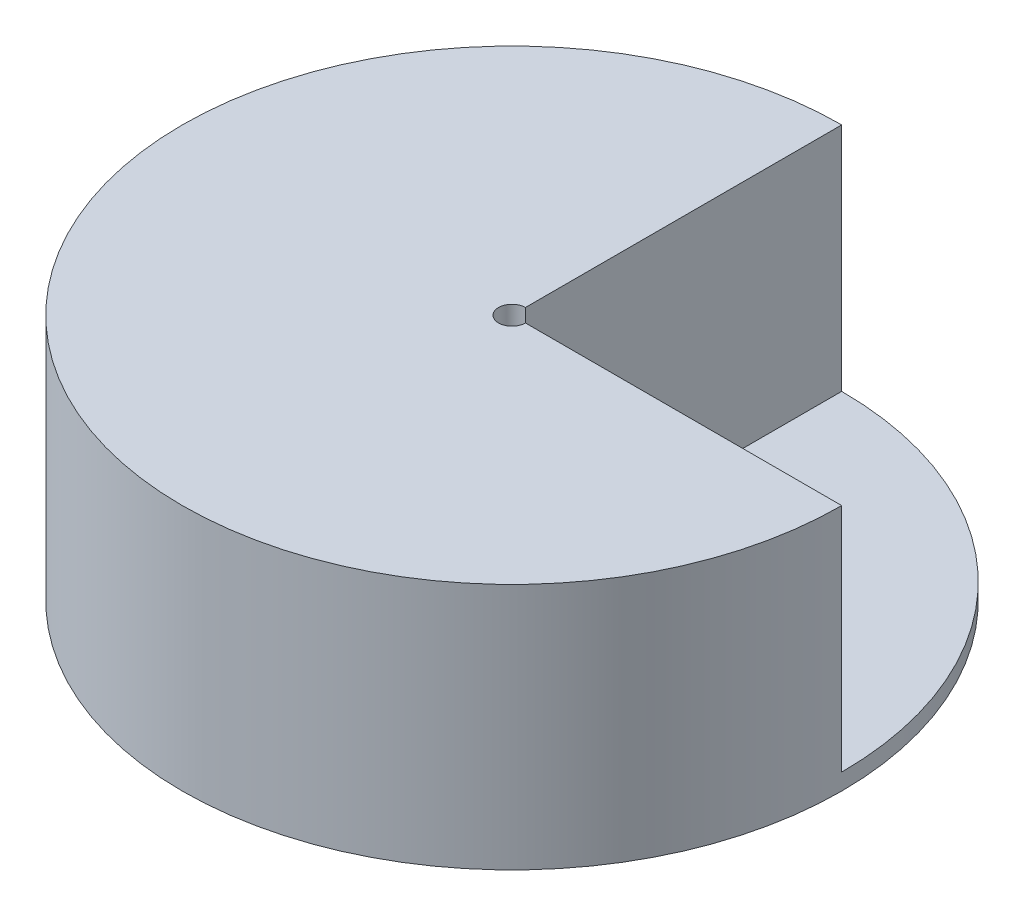
ISO-10303-21;
HEADER;
FILE_DESCRIPTION(('STEP AP214'),'2;1');
FILE_NAME('part.step','',(''),(''),'','','');
FILE_SCHEMA(('AUTOMOTIVE_DESIGN { 1 0 10303 214 1 1 1 1 }'));
ENDSEC;
DATA;
#1=APPLICATION_CONTEXT('core data for automotive mechanical design processes');
#2=APPLICATION_PROTOCOL_DEFINITION('international standard','automotive_design',2000,#1);
#3=PRODUCT_CONTEXT('',#1,'mechanical');
#4=PRODUCT('Part','Part','',(#3));
#5=PRODUCT_RELATED_PRODUCT_CATEGORY('part','',(#4));
#6=PRODUCT_DEFINITION_FORMATION('','',#4);
#7=PRODUCT_DEFINITION_CONTEXT('part definition',#1,'design');
#8=PRODUCT_DEFINITION('design','',#6,#7);
#9=PRODUCT_DEFINITION_SHAPE('','',#8);
#10=(LENGTH_UNIT() NAMED_UNIT(*) SI_UNIT(.MILLI.,.METRE.));
#11=(NAMED_UNIT(*) PLANE_ANGLE_UNIT() SI_UNIT($,.RADIAN.));
#12=(NAMED_UNIT(*) SI_UNIT($,.STERADIAN.) SOLID_ANGLE_UNIT());
#13=UNCERTAINTY_MEASURE_WITH_UNIT(LENGTH_MEASURE(1.E-05),#10,'distance_accuracy_value','');
#14=(GEOMETRIC_REPRESENTATION_CONTEXT(3) GLOBAL_UNCERTAINTY_ASSIGNED_CONTEXT((#13)) GLOBAL_UNIT_ASSIGNED_CONTEXT((#10,
#11,#12)) REPRESENTATION_CONTEXT('',''));
#15=CARTESIAN_POINT('',(0.,0.,0.));
#16=DIRECTION('',(0.,0.,1.));
#17=DIRECTION('',(1.,0.,0.));
#18=AXIS2_PLACEMENT_3D('',#15,#16,#17);
#19=CARTESIAN_POINT('',(0.,15.,0.));
#20=DIRECTION('',(0.,-1.,0.));
#21=DIRECTION('',(0.,0.,-1.));
#22=AXIS2_PLACEMENT_3D('',#19,#20,#21);
#23=CYLINDRICAL_SURFACE('',#22,20.);
#24=CARTESIAN_POINT('',(0.,0.999999999999999,0.));
#25=DIRECTION('',(0.,1.,0.));
#26=DIRECTION('',(0.,0.,1.));
#27=AXIS2_PLACEMENT_3D('',#24,#25,#26);
#28=CIRCLE('',#27,20.);
#29=CARTESIAN_POINT('',(20.,0.999999999999999,0.));
#30=VERTEX_POINT('',#29);
#31=CARTESIAN_POINT('',(0.,0.999999999999999,-20.));
#32=VERTEX_POINT('',#31);
#33=EDGE_CURVE('E97',#30,#32,#28,.T.);
#34=ORIENTED_EDGE('',*,*,#33,.F.);
#35=DIRECTION('',(0.,1.,0.));
#36=VECTOR('',#35,1.);
#37=CARTESIAN_POINT('',(20.,0.999999999999999,0.));
#38=LINE('',#37,#36);
#39=CARTESIAN_POINT('',(20.,15.,0.));
#40=VERTEX_POINT('',#39);
#41=EDGE_CURVE('E106',#30,#40,#38,.T.);
#42=ORIENTED_EDGE('',*,*,#41,.T.);
#43=CARTESIAN_POINT('',(0.,15.,0.));
#44=DIRECTION('',(0.,1.,0.));
#45=DIRECTION('',(0.,0.,1.));
#46=AXIS2_PLACEMENT_3D('',#43,#44,#45);
#47=CIRCLE('',#46,20.);
#48=CARTESIAN_POINT('',(0.,15.,-20.));
#49=VERTEX_POINT('',#48);
#50=EDGE_CURVE('E46',#49,#40,#47,.T.);
#51=ORIENTED_EDGE('',*,*,#50,.F.);
#52=DIRECTION('',(0.,1.,0.));
#53=VECTOR('',#52,1.);
#54=CARTESIAN_POINT('',(0.,0.999999999999999,-20.));
#55=LINE('',#54,#53);
#56=EDGE_CURVE('E60',#32,#49,#55,.T.);
#57=ORIENTED_EDGE('',*,*,#56,.F.);
#58=EDGE_LOOP('',(#34,#42,#51,#57));
#59=FACE_BOUND('',#58,.T.);
#60=CARTESIAN_POINT('',(0.,0.,0.));
#61=DIRECTION('',(0.,1.,0.));
#62=DIRECTION('',(0.,0.,1.));
#63=AXIS2_PLACEMENT_3D('',#60,#61,#62);
#64=CIRCLE('',#63,20.);
#65=CARTESIAN_POINT('',(0.,0.,20.));
#66=VERTEX_POINT('',#65);
#67=EDGE_CURVE('E108',#66,#66,#64,.T.);
#68=ORIENTED_EDGE('',*,*,#67,.T.);
#69=EDGE_LOOP('',(#68));
#70=FACE_BOUND('',#69,.T.);
#71=ADVANCED_FACE('F39',(#59,#70),#23,.T.);
#72=CARTESIAN_POINT('',(0.,15.,0.));
#73=DIRECTION('',(0.,1.,0.));
#74=DIRECTION('',(0.,0.,1.));
#75=AXIS2_PLACEMENT_3D('',#72,#73,#74);
#76=PLANE('',#75);
#77=CARTESIAN_POINT('',(0.,15.,0.));
#78=DIRECTION('',(0.,1.,0.));
#79=DIRECTION('',(0.,0.,1.));
#80=AXIS2_PLACEMENT_3D('',#77,#78,#79);
#81=CIRCLE('',#80,0.815);
#82=CARTESIAN_POINT('',(0.,15.,-0.815));
#83=VERTEX_POINT('',#82);
#84=CARTESIAN_POINT('',(0.815,15.,0.));
#85=VERTEX_POINT('',#84);
#86=EDGE_CURVE('E77',#83,#85,#81,.T.);
#87=ORIENTED_EDGE('',*,*,#86,.F.);
#88=DIRECTION('',(0.,0.,1.));
#89=VECTOR('',#88,1.);
#90=CARTESIAN_POINT('',(0.,15.,-20.));
#91=LINE('',#90,#89);
#92=EDGE_CURVE('E98',#49,#83,#91,.T.);
#93=ORIENTED_EDGE('',*,*,#92,.F.);
#94=ORIENTED_EDGE('',*,*,#50,.T.);
#95=DIRECTION('',(1.,0.,0.));
#96=VECTOR('',#95,1.);
#97=CARTESIAN_POINT('',(0.,15.,0.));
#98=LINE('',#97,#96);
#99=EDGE_CURVE('E89',#85,#40,#98,.T.);
#100=ORIENTED_EDGE('',*,*,#99,.F.);
#101=EDGE_LOOP('',(#87,#93,#94,#100));
#102=FACE_BOUND('',#101,.T.);
#103=ADVANCED_FACE('F95',(#102),#76,.T.);
#104=CARTESIAN_POINT('',(0.,0.,0.));
#105=DIRECTION('',(0.,1.,0.));
#106=DIRECTION('',(0.,0.,1.));
#107=AXIS2_PLACEMENT_3D('',#104,#105,#106);
#108=PLANE('',#107);
#109=CARTESIAN_POINT('',(0.,0.,0.));
#110=DIRECTION('',(0.,1.,0.));
#111=DIRECTION('',(0.,0.,1.));
#112=AXIS2_PLACEMENT_3D('',#109,#110,#111);
#113=CIRCLE('',#112,0.815);
#114=CARTESIAN_POINT('',(0.,0.,0.815));
#115=VERTEX_POINT('',#114);
#116=EDGE_CURVE('E92',#115,#115,#113,.T.);
#117=ORIENTED_EDGE('',*,*,#116,.T.);
#118=EDGE_LOOP('',(#117));
#119=FACE_BOUND('',#118,.T.);
#120=ORIENTED_EDGE('',*,*,#67,.F.);
#121=EDGE_LOOP('',(#120));
#122=FACE_BOUND('',#121,.T.);
#123=ADVANCED_FACE('F114',(#119,#122),#108,.F.);
#124=CARTESIAN_POINT('',(0.,0.999999999999999,0.));
#125=DIRECTION('',(0.,0.,1.));
#126=DIRECTION('',(1.,0.,0.));
#127=AXIS2_PLACEMENT_3D('',#124,#125,#126);
#128=PLANE('',#127);
#129=DIRECTION('',(1.,0.,0.));
#130=VECTOR('',#129,1.);
#131=CARTESIAN_POINT('',(0.,0.999999999999999,0.));
#132=LINE('',#131,#130);
#133=CARTESIAN_POINT('',(0.815,1.,0.));
#134=VERTEX_POINT('',#133);
#135=EDGE_CURVE('E91',#134,#30,#132,.T.);
#136=ORIENTED_EDGE('',*,*,#135,.F.);
#137=DIRECTION('',(0.,1.,0.));
#138=VECTOR('',#137,1.);
#139=CARTESIAN_POINT('',(0.815,-135.,0.));
#140=LINE('',#139,#138);
#141=EDGE_CURVE('E52',#134,#85,#140,.T.);
#142=ORIENTED_EDGE('',*,*,#141,.T.);
#143=ORIENTED_EDGE('',*,*,#99,.T.);
#144=ORIENTED_EDGE('',*,*,#41,.F.);
#145=EDGE_LOOP('',(#136,#142,#143,#144));
#146=FACE_BOUND('',#145,.T.);
#147=ADVANCED_FACE('F87',(#146),#128,.F.);
#148=CARTESIAN_POINT('',(0.,0.999999999999999,-20.));
#149=DIRECTION('',(-1.,0.,0.));
#150=DIRECTION('',(0.,0.,1.));
#151=AXIS2_PLACEMENT_3D('',#148,#149,#150);
#152=PLANE('',#151);
#153=ORIENTED_EDGE('',*,*,#92,.T.);
#154=DIRECTION('',(0.,1.,0.));
#155=VECTOR('',#154,1.);
#156=CARTESIAN_POINT('',(0.,-135.,-0.815));
#157=LINE('',#156,#155);
#158=CARTESIAN_POINT('',(0.,1.,-0.815));
#159=VERTEX_POINT('',#158);
#160=EDGE_CURVE('E81',#83,#159,#157,.F.);
#161=ORIENTED_EDGE('',*,*,#160,.T.);
#162=DIRECTION('',(0.,0.,1.));
#163=VECTOR('',#162,1.);
#164=CARTESIAN_POINT('',(0.,0.999999999999999,-20.));
#165=LINE('',#164,#163);
#166=EDGE_CURVE('E101',#32,#159,#165,.T.);
#167=ORIENTED_EDGE('',*,*,#166,.F.);
#168=ORIENTED_EDGE('',*,*,#56,.T.);
#169=EDGE_LOOP('',(#153,#161,#167,#168));
#170=FACE_BOUND('',#169,.T.);
#171=ADVANCED_FACE('F121',(#170),#152,.F.);
#172=CARTESIAN_POINT('',(0.,0.999999999999999,0.));
#173=DIRECTION('',(0.,1.,0.));
#174=DIRECTION('',(0.,0.,1.));
#175=AXIS2_PLACEMENT_3D('',#172,#173,#174);
#176=PLANE('',#175);
#177=CARTESIAN_POINT('',(0.,1.,0.));
#178=DIRECTION('',(0.,1.,0.));
#179=DIRECTION('',(0.,0.,1.));
#180=AXIS2_PLACEMENT_3D('',#177,#178,#179);
#181=CIRCLE('',#180,0.815);
#182=EDGE_CURVE('E11',#134,#159,#181,.T.);
#183=ORIENTED_EDGE('',*,*,#182,.F.);
#184=ORIENTED_EDGE('',*,*,#135,.T.);
#185=ORIENTED_EDGE('',*,*,#33,.T.);
#186=ORIENTED_EDGE('',*,*,#166,.T.);
#187=EDGE_LOOP('',(#183,#184,#185,#186));
#188=FACE_BOUND('',#187,.T.);
#189=ADVANCED_FACE('F132',(#188),#176,.T.);
#190=CARTESIAN_POINT('',(0.,-135.,0.));
#191=DIRECTION('',(0.,1.,0.));
#192=DIRECTION('',(0.,0.,1.));
#193=AXIS2_PLACEMENT_3D('',#190,#191,#192);
#194=CYLINDRICAL_SURFACE('',#193,0.815);
#195=ORIENTED_EDGE('',*,*,#182,.T.);
#196=ORIENTED_EDGE('',*,*,#160,.F.);
#197=ORIENTED_EDGE('',*,*,#86,.T.);
#198=ORIENTED_EDGE('',*,*,#141,.F.);
#199=EDGE_LOOP('',(#195,#196,#197,#198));
#200=FACE_BOUND('',#199,.T.);
#201=ORIENTED_EDGE('',*,*,#116,.F.);
#202=EDGE_LOOP('',(#201));
#203=FACE_BOUND('',#202,.T.);
#204=ADVANCED_FACE('F78',(#200,#203),#194,.F.);
#205=CLOSED_SHELL('',(#71,#103,#123,#147,#171,#189,#204));
#206=MANIFOLD_SOLID_BREP('B2',#205);
#207=ADVANCED_BREP_SHAPE_REPRESENTATION('',(#18,#206),#14);
#208=SHAPE_DEFINITION_REPRESENTATION(#9,#207);
ENDSEC;
END-ISO-10303-21;
